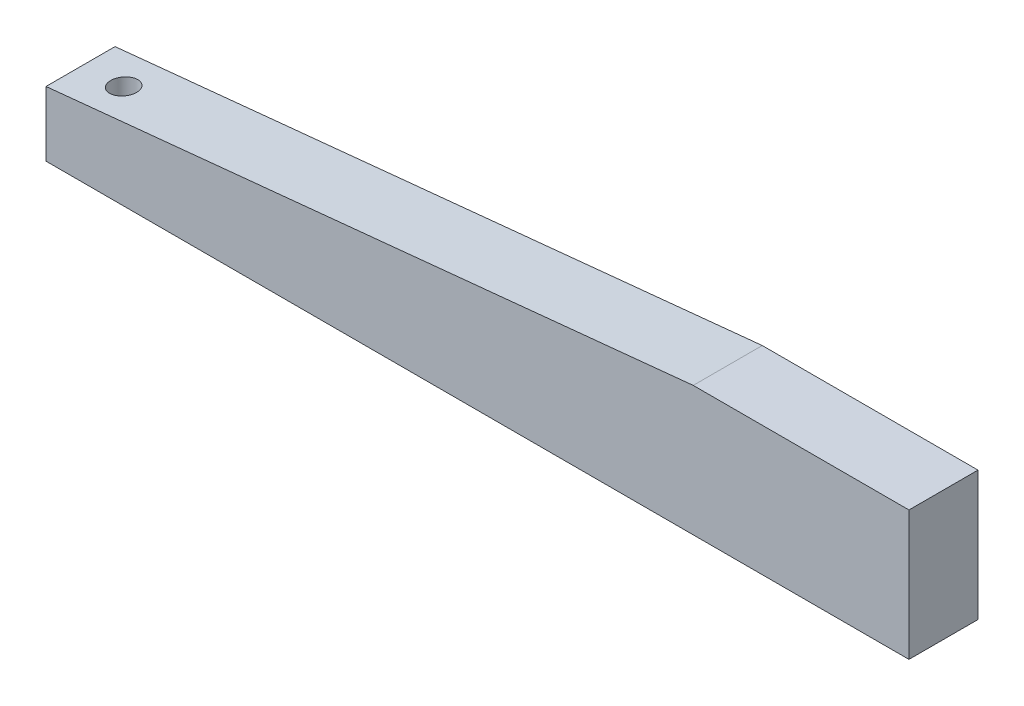
ISO-10303-21;
HEADER;
FILE_DESCRIPTION(('STEP AP214'),'2;1');
FILE_NAME('part.step','',(''),(''),'','','');
FILE_SCHEMA(('AUTOMOTIVE_DESIGN { 1 0 10303 214 1 1 1 1 }'));
ENDSEC;
DATA;
#1=APPLICATION_CONTEXT('core data for automotive mechanical design processes');
#2=APPLICATION_PROTOCOL_DEFINITION('international standard','automotive_design',2000,#1);
#3=PRODUCT_CONTEXT('',#1,'mechanical');
#4=PRODUCT('Part','Part','',(#3));
#5=PRODUCT_RELATED_PRODUCT_CATEGORY('part','',(#4));
#6=PRODUCT_DEFINITION_FORMATION('','',#4);
#7=PRODUCT_DEFINITION_CONTEXT('part definition',#1,'design');
#8=PRODUCT_DEFINITION('design','',#6,#7);
#9=PRODUCT_DEFINITION_SHAPE('','',#8);
#10=(LENGTH_UNIT() NAMED_UNIT(*) SI_UNIT(.MILLI.,.METRE.));
#11=(NAMED_UNIT(*) PLANE_ANGLE_UNIT() SI_UNIT($,.RADIAN.));
#12=(NAMED_UNIT(*) SI_UNIT($,.STERADIAN.) SOLID_ANGLE_UNIT());
#13=UNCERTAINTY_MEASURE_WITH_UNIT(LENGTH_MEASURE(1.E-05),#10,'distance_accuracy_value','');
#14=(GEOMETRIC_REPRESENTATION_CONTEXT(3) GLOBAL_UNCERTAINTY_ASSIGNED_CONTEXT((#13)) GLOBAL_UNIT_ASSIGNED_CONTEXT((#10,
#11,#12)) REPRESENTATION_CONTEXT('',''));
#15=CARTESIAN_POINT('',(0.,0.,0.));
#16=DIRECTION('',(0.,0.,1.));
#17=DIRECTION('',(1.,0.,0.));
#18=AXIS2_PLACEMENT_3D('',#15,#16,#17);
#19=CARTESIAN_POINT('',(0.,15.,16.));
#20=DIRECTION('',(1.,0.,0.));
#21=DIRECTION('',(0.,1.,0.));
#22=AXIS2_PLACEMENT_3D('',#19,#20,#21);
#23=PLANE('',#22);
#24=DIRECTION('',(0.,-1.,0.));
#25=VECTOR('',#24,1.);
#26=CARTESIAN_POINT('',(0.,15.,0.));
#27=LINE('',#26,#25);
#28=CARTESIAN_POINT('',(0.,15.,0.));
#29=VERTEX_POINT('',#28);
#30=CARTESIAN_POINT('',(0.,0.,0.));
#31=VERTEX_POINT('',#30);
#32=EDGE_CURVE('E108',#29,#31,#27,.T.);
#33=ORIENTED_EDGE('',*,*,#32,.T.);
#34=DIRECTION('',(0.,0.,-1.));
#35=VECTOR('',#34,1.);
#36=CARTESIAN_POINT('',(0.,0.,16.));
#37=LINE('',#36,#35);
#38=CARTESIAN_POINT('',(0.,0.,16.));
#39=VERTEX_POINT('',#38);
#40=EDGE_CURVE('E11',#39,#31,#37,.T.);
#41=ORIENTED_EDGE('',*,*,#40,.F.);
#42=DIRECTION('',(0.,-1.,0.));
#43=VECTOR('',#42,1.);
#44=CARTESIAN_POINT('',(0.,15.,16.));
#45=LINE('',#44,#43);
#46=CARTESIAN_POINT('',(0.,15.,16.));
#47=VERTEX_POINT('',#46);
#48=EDGE_CURVE('E117',#47,#39,#45,.T.);
#49=ORIENTED_EDGE('',*,*,#48,.F.);
#50=DIRECTION('',(0.,0.,-1.));
#51=VECTOR('',#50,1.);
#52=CARTESIAN_POINT('',(0.,15.,16.));
#53=LINE('',#52,#51);
#54=EDGE_CURVE('E104',#47,#29,#53,.T.);
#55=ORIENTED_EDGE('',*,*,#54,.T.);
#56=EDGE_LOOP('',(#33,#41,#49,#55));
#57=FACE_BOUND('',#56,.T.);
#58=ADVANCED_FACE('F33',(#57),#23,.F.);
#59=CARTESIAN_POINT('',(0.,0.,16.));
#60=DIRECTION('',(0.,1.,0.));
#61=DIRECTION('',(0.,0.,1.));
#62=AXIS2_PLACEMENT_3D('',#59,#60,#61);
#63=PLANE('',#62);
#64=CARTESIAN_POINT('',(10.,0.,8.));
#65=DIRECTION('',(0.,1.,0.));
#66=DIRECTION('',(0.,0.,1.));
#67=AXIS2_PLACEMENT_3D('',#64,#65,#66);
#68=CIRCLE('',#67,3.);
#69=CARTESIAN_POINT('',(10.,0.,11.));
#70=VERTEX_POINT('',#69);
#71=EDGE_CURVE('E112',#70,#70,#68,.T.);
#72=ORIENTED_EDGE('',*,*,#71,.T.);
#73=EDGE_LOOP('',(#72));
#74=FACE_BOUND('',#73,.T.);
#75=DIRECTION('',(1.,0.,0.));
#76=VECTOR('',#75,1.);
#77=CARTESIAN_POINT('',(0.,0.,0.));
#78=LINE('',#77,#76);
#79=CARTESIAN_POINT('',(200.,0.,0.));
#80=VERTEX_POINT('',#79);
#81=EDGE_CURVE('E111',#31,#80,#78,.T.);
#82=ORIENTED_EDGE('',*,*,#81,.T.);
#83=DIRECTION('',(0.,0.,-1.));
#84=VECTOR('',#83,1.);
#85=CARTESIAN_POINT('',(200.,0.,16.));
#86=LINE('',#85,#84);
#87=CARTESIAN_POINT('',(200.,0.,16.));
#88=VERTEX_POINT('',#87);
#89=EDGE_CURVE('E42',#88,#80,#86,.T.);
#90=ORIENTED_EDGE('',*,*,#89,.F.);
#91=DIRECTION('',(1.,0.,0.));
#92=VECTOR('',#91,1.);
#93=CARTESIAN_POINT('',(0.,0.,16.));
#94=LINE('',#93,#92);
#95=EDGE_CURVE('E84',#39,#88,#94,.T.);
#96=ORIENTED_EDGE('',*,*,#95,.F.);
#97=ORIENTED_EDGE('',*,*,#40,.T.);
#98=EDGE_LOOP('',(#82,#90,#96,#97));
#99=FACE_BOUND('',#98,.T.);
#100=ADVANCED_FACE('F139',(#74,#99),#63,.F.);
#101=CARTESIAN_POINT('',(200.,0.,16.));
#102=DIRECTION('',(-1.,0.,0.));
#103=DIRECTION('',(0.,0.,1.));
#104=AXIS2_PLACEMENT_3D('',#101,#102,#103);
#105=PLANE('',#104);
#106=DIRECTION('',(0.,1.,0.));
#107=VECTOR('',#106,1.);
#108=CARTESIAN_POINT('',(200.,0.,0.));
#109=LINE('',#108,#107);
#110=CARTESIAN_POINT('',(200.,30.,0.));
#111=VERTEX_POINT('',#110);
#112=EDGE_CURVE('E99',#80,#111,#109,.T.);
#113=ORIENTED_EDGE('',*,*,#112,.T.);
#114=DIRECTION('',(0.,0.,-1.));
#115=VECTOR('',#114,1.);
#116=CARTESIAN_POINT('',(200.,30.,16.));
#117=LINE('',#116,#115);
#118=CARTESIAN_POINT('',(200.,30.,16.));
#119=VERTEX_POINT('',#118);
#120=EDGE_CURVE('E96',#119,#111,#117,.T.);
#121=ORIENTED_EDGE('',*,*,#120,.F.);
#122=DIRECTION('',(0.,1.,0.));
#123=VECTOR('',#122,1.);
#124=CARTESIAN_POINT('',(200.,0.,16.));
#125=LINE('',#124,#123);
#126=EDGE_CURVE('E88',#88,#119,#125,.T.);
#127=ORIENTED_EDGE('',*,*,#126,.F.);
#128=ORIENTED_EDGE('',*,*,#89,.T.);
#129=EDGE_LOOP('',(#113,#121,#127,#128));
#130=FACE_BOUND('',#129,.T.);
#131=ADVANCED_FACE('F97',(#130),#105,.F.);
#132=CARTESIAN_POINT('',(200.,30.,16.));
#133=DIRECTION('',(0.,-1.,0.));
#134=DIRECTION('',(1.,0.,0.));
#135=AXIS2_PLACEMENT_3D('',#132,#133,#134);
#136=PLANE('',#135);
#137=DIRECTION('',(-1.,0.,0.));
#138=VECTOR('',#137,1.);
#139=CARTESIAN_POINT('',(200.,30.,0.));
#140=LINE('',#139,#138);
#141=CARTESIAN_POINT('',(150.,30.,0.));
#142=VERTEX_POINT('',#141);
#143=EDGE_CURVE('E70',#111,#142,#140,.T.);
#144=ORIENTED_EDGE('',*,*,#143,.T.);
#145=DIRECTION('',(0.,0.,-1.));
#146=VECTOR('',#145,1.);
#147=CARTESIAN_POINT('',(150.,30.,16.));
#148=LINE('',#147,#146);
#149=CARTESIAN_POINT('',(150.,30.,16.));
#150=VERTEX_POINT('',#149);
#151=EDGE_CURVE('E100',#150,#142,#148,.T.);
#152=ORIENTED_EDGE('',*,*,#151,.F.);
#153=DIRECTION('',(-1.,0.,0.));
#154=VECTOR('',#153,1.);
#155=CARTESIAN_POINT('',(200.,30.,16.));
#156=LINE('',#155,#154);
#157=EDGE_CURVE('E92',#119,#150,#156,.T.);
#158=ORIENTED_EDGE('',*,*,#157,.F.);
#159=ORIENTED_EDGE('',*,*,#120,.T.);
#160=EDGE_LOOP('',(#144,#152,#158,#159));
#161=FACE_BOUND('',#160,.T.);
#162=ADVANCED_FACE('F102',(#161),#136,.F.);
#163=CARTESIAN_POINT('',(150.,30.,16.));
#164=DIRECTION('',(0.0995037190209988,-0.995037190209989,0.));
#165=DIRECTION('',(0.995037190209989,0.0995037190209989,0.));
#166=AXIS2_PLACEMENT_3D('',#163,#164,#165);
#167=PLANE('',#166);
#168=CARTESIAN_POINT('',(10.,16.,8.));
#169=DIRECTION('',(0.0995037190209988,-0.995037190209989,0.));
#170=DIRECTION('',(-0.995037190209989,-0.0995037190209989,0.));
#171=AXIS2_PLACEMENT_3D('',#168,#169,#170);
#172=ELLIPSE('',#171,3.01496268633626,3.);
#173=CARTESIAN_POINT('',(7.,15.7,8.));
#174=VERTEX_POINT('',#173);
#175=EDGE_CURVE('E36',#174,#174,#172,.T.);
#176=ORIENTED_EDGE('',*,*,#175,.T.);
#177=EDGE_LOOP('',(#176));
#178=FACE_BOUND('',#177,.T.);
#179=DIRECTION('',(-0.995037190209989,-0.0995037190209989,0.));
#180=VECTOR('',#179,1.);
#181=CARTESIAN_POINT('',(150.,30.,0.));
#182=LINE('',#181,#180);
#183=EDGE_CURVE('E76',#142,#29,#182,.T.);
#184=ORIENTED_EDGE('',*,*,#183,.T.);
#185=ORIENTED_EDGE('',*,*,#54,.F.);
#186=DIRECTION('',(-0.995037190209989,-0.0995037190209989,0.));
#187=VECTOR('',#186,1.);
#188=CARTESIAN_POINT('',(150.,30.,16.));
#189=LINE('',#188,#187);
#190=EDGE_CURVE('E50',#150,#47,#189,.T.);
#191=ORIENTED_EDGE('',*,*,#190,.F.);
#192=ORIENTED_EDGE('',*,*,#151,.T.);
#193=EDGE_LOOP('',(#184,#185,#191,#192));
#194=FACE_BOUND('',#193,.T.);
#195=ADVANCED_FACE('F126',(#178,#194),#167,.F.);
#196=CARTESIAN_POINT('',(0.,0.,16.));
#197=DIRECTION('',(0.,0.,1.));
#198=DIRECTION('',(1.,0.,0.));
#199=AXIS2_PLACEMENT_3D('',#196,#197,#198);
#200=PLANE('',#199);
#201=ORIENTED_EDGE('',*,*,#48,.T.);
#202=ORIENTED_EDGE('',*,*,#95,.T.);
#203=ORIENTED_EDGE('',*,*,#126,.T.);
#204=ORIENTED_EDGE('',*,*,#157,.T.);
#205=ORIENTED_EDGE('',*,*,#190,.T.);
#206=EDGE_LOOP('',(#201,#202,#203,#204,#205));
#207=FACE_BOUND('',#206,.T.);
#208=ADVANCED_FACE('F90',(#207),#200,.T.);
#209=CARTESIAN_POINT('',(0.,0.,0.));
#210=DIRECTION('',(0.,0.,1.));
#211=DIRECTION('',(1.,0.,0.));
#212=AXIS2_PLACEMENT_3D('',#209,#210,#211);
#213=PLANE('',#212);
#214=ORIENTED_EDGE('',*,*,#32,.F.);
#215=ORIENTED_EDGE('',*,*,#183,.F.);
#216=ORIENTED_EDGE('',*,*,#143,.F.);
#217=ORIENTED_EDGE('',*,*,#112,.F.);
#218=ORIENTED_EDGE('',*,*,#81,.F.);
#219=EDGE_LOOP('',(#214,#215,#216,#217,#218));
#220=FACE_BOUND('',#219,.T.);
#221=ADVANCED_FACE('F122',(#220),#213,.F.);
#222=CARTESIAN_POINT('',(10.,30.,8.));
#223=DIRECTION('',(0.,-1.,0.));
#224=DIRECTION('',(0.,0.,-1.));
#225=AXIS2_PLACEMENT_3D('',#222,#223,#224);
#226=CYLINDRICAL_SURFACE('',#225,3.);
#227=ORIENTED_EDGE('',*,*,#175,.F.);
#228=EDGE_LOOP('',(#227));
#229=FACE_BOUND('',#228,.T.);
#230=ORIENTED_EDGE('',*,*,#71,.F.);
#231=EDGE_LOOP('',(#230));
#232=FACE_BOUND('',#231,.T.);
#233=ADVANCED_FACE('F155',(#229,#232),#226,.F.);
#234=CLOSED_SHELL('',(#58,#100,#131,#162,#195,#208,#221,#233));
#235=MANIFOLD_SOLID_BREP('B2',#234);
#236=ADVANCED_BREP_SHAPE_REPRESENTATION('',(#18,#235),#14);
#237=SHAPE_DEFINITION_REPRESENTATION(#9,#236);
ENDSEC;
END-ISO-10303-21;
